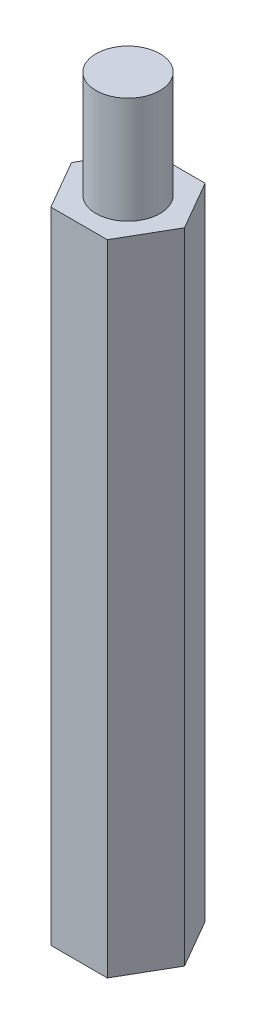
ISO-10303-21;
HEADER;
FILE_DESCRIPTION(('STEP AP214'),'2;1');
FILE_NAME('part.step','',(''),(''),'','','');
FILE_SCHEMA(('AUTOMOTIVE_DESIGN { 1 0 10303 214 1 1 1 1 }'));
ENDSEC;
DATA;
#1=APPLICATION_CONTEXT('core data for automotive mechanical design processes');
#2=APPLICATION_PROTOCOL_DEFINITION('international standard','automotive_design',2000,#1);
#3=PRODUCT_CONTEXT('',#1,'mechanical');
#4=PRODUCT('Part','Part','',(#3));
#5=PRODUCT_RELATED_PRODUCT_CATEGORY('part','',(#4));
#6=PRODUCT_DEFINITION_FORMATION('','',#4);
#7=PRODUCT_DEFINITION_CONTEXT('part definition',#1,'design');
#8=PRODUCT_DEFINITION('design','',#6,#7);
#9=PRODUCT_DEFINITION_SHAPE('','',#8);
#10=(LENGTH_UNIT() NAMED_UNIT(*) SI_UNIT(.MILLI.,.METRE.));
#11=(NAMED_UNIT(*) PLANE_ANGLE_UNIT() SI_UNIT($,.RADIAN.));
#12=(NAMED_UNIT(*) SI_UNIT($,.STERADIAN.) SOLID_ANGLE_UNIT());
#13=UNCERTAINTY_MEASURE_WITH_UNIT(LENGTH_MEASURE(1.E-05),#10,'distance_accuracy_value','');
#14=(GEOMETRIC_REPRESENTATION_CONTEXT(3) GLOBAL_UNCERTAINTY_ASSIGNED_CONTEXT((#13)) GLOBAL_UNIT_ASSIGNED_CONTEXT((#10,
#11,#12)) REPRESENTATION_CONTEXT('',''));
#15=CARTESIAN_POINT('',(0.,0.,0.));
#16=DIRECTION('',(0.,0.,1.));
#17=DIRECTION('',(1.,0.,0.));
#18=AXIS2_PLACEMENT_3D('',#15,#16,#17);
#19=CARTESIAN_POINT('',(1.32500000000003,30.,2.29496732002875));
#20=DIRECTION('',(-0.866025403784441,0.,-0.499999999999995));
#21=DIRECTION('',(-0.499999999999995,0.,0.866025403784441));
#22=AXIS2_PLACEMENT_3D('',#19,#20,#21);
#23=PLANE('',#22);
#24=DIRECTION('',(0.499999999999995,0.,-0.866025403784441));
#25=VECTOR('',#24,1.);
#26=CARTESIAN_POINT('',(1.32500000000003,0.,2.29496732002875));
#27=LINE('',#26,#25);
#28=CARTESIAN_POINT('',(1.32500000000003,0.,2.29496732002875));
#29=VERTEX_POINT('',#28);
#30=CARTESIAN_POINT('',(2.65,0.,0.));
#31=VERTEX_POINT('',#30);
#32=EDGE_CURVE('E130',#29,#31,#27,.T.);
#33=ORIENTED_EDGE('',*,*,#32,.T.);
#34=DIRECTION('',(0.,-1.,0.));
#35=VECTOR('',#34,1.);
#36=CARTESIAN_POINT('',(2.65,30.,0.));
#37=LINE('',#36,#35);
#38=CARTESIAN_POINT('',(2.65,30.,0.));
#39=VERTEX_POINT('',#38);
#40=EDGE_CURVE('E42',#39,#31,#37,.T.);
#41=ORIENTED_EDGE('',*,*,#40,.F.);
#42=DIRECTION('',(0.499999999999995,0.,-0.866025403784441));
#43=VECTOR('',#42,1.);
#44=CARTESIAN_POINT('',(1.32500000000003,30.,2.29496732002875));
#45=LINE('',#44,#43);
#46=CARTESIAN_POINT('',(1.32500000000003,30.,2.29496732002875));
#47=VERTEX_POINT('',#46);
#48=EDGE_CURVE('E147',#47,#39,#45,.T.);
#49=ORIENTED_EDGE('',*,*,#48,.F.);
#50=DIRECTION('',(0.,-1.,0.));
#51=VECTOR('',#50,1.);
#52=CARTESIAN_POINT('',(1.32500000000003,30.,2.29496732002875));
#53=LINE('',#52,#51);
#54=EDGE_CURVE('E126',#47,#29,#53,.T.);
#55=ORIENTED_EDGE('',*,*,#54,.T.);
#56=EDGE_LOOP('',(#33,#41,#49,#55));
#57=FACE_BOUND('',#56,.T.);
#58=ADVANCED_FACE('F39',(#57),#23,.F.);
#59=CARTESIAN_POINT('',(2.65,30.,0.));
#60=DIRECTION('',(-0.866025403784438,0.,0.500000000000001));
#61=DIRECTION('',(0.500000000000001,0.,0.866025403784438));
#62=AXIS2_PLACEMENT_3D('',#59,#60,#61);
#63=PLANE('',#62);
#64=DIRECTION('',(-0.500000000000001,0.,-0.866025403784438));
#65=VECTOR('',#64,1.);
#66=CARTESIAN_POINT('',(2.65,0.,0.));
#67=LINE('',#66,#65);
#68=CARTESIAN_POINT('',(1.32499999999999,0.,-2.29496732002877));
#69=VERTEX_POINT('',#68);
#70=EDGE_CURVE('E134',#31,#69,#67,.T.);
#71=ORIENTED_EDGE('',*,*,#70,.T.);
#72=DIRECTION('',(0.,-1.,0.));
#73=VECTOR('',#72,1.);
#74=CARTESIAN_POINT('',(1.32499999999999,30.,-2.29496732002877));
#75=LINE('',#74,#73);
#76=CARTESIAN_POINT('',(1.32499999999999,30.,-2.29496732002877));
#77=VERTEX_POINT('',#76);
#78=EDGE_CURVE('E153',#77,#69,#75,.T.);
#79=ORIENTED_EDGE('',*,*,#78,.F.);
#80=DIRECTION('',(-0.500000000000001,0.,-0.866025403784438));
#81=VECTOR('',#80,1.);
#82=CARTESIAN_POINT('',(2.65,30.,0.));
#83=LINE('',#82,#81);
#84=EDGE_CURVE('E95',#39,#77,#83,.T.);
#85=ORIENTED_EDGE('',*,*,#84,.F.);
#86=ORIENTED_EDGE('',*,*,#40,.T.);
#87=EDGE_LOOP('',(#71,#79,#85,#86));
#88=FACE_BOUND('',#87,.T.);
#89=ADVANCED_FACE('F160',(#88),#63,.F.);
#90=CARTESIAN_POINT('',(1.32499999999999,30.,-2.29496732002877));
#91=DIRECTION('',(0.,0.,1.));
#92=DIRECTION('',(1.,0.,0.));
#93=AXIS2_PLACEMENT_3D('',#90,#91,#92);
#94=PLANE('',#93);
#95=DIRECTION('',(-1.,0.,0.));
#96=VECTOR('',#95,1.);
#97=CARTESIAN_POINT('',(1.32499999999999,0.,-2.29496732002877));
#98=LINE('',#97,#96);
#99=CARTESIAN_POINT('',(-1.32500000000001,0.,-2.29496732002876));
#100=VERTEX_POINT('',#99);
#101=EDGE_CURVE('E138',#69,#100,#98,.T.);
#102=ORIENTED_EDGE('',*,*,#101,.T.);
#103=DIRECTION('',(0.,-1.,0.));
#104=VECTOR('',#103,1.);
#105=CARTESIAN_POINT('',(-1.32500000000001,30.,-2.29496732002876));
#106=LINE('',#105,#104);
#107=CARTESIAN_POINT('',(-1.32500000000001,30.,-2.29496732002876));
#108=VERTEX_POINT('',#107);
#109=EDGE_CURVE('E119',#108,#100,#106,.T.);
#110=ORIENTED_EDGE('',*,*,#109,.F.);
#111=DIRECTION('',(-1.,0.,0.));
#112=VECTOR('',#111,1.);
#113=CARTESIAN_POINT('',(1.32499999999999,30.,-2.29496732002877));
#114=LINE('',#113,#112);
#115=EDGE_CURVE('E108',#77,#108,#114,.T.);
#116=ORIENTED_EDGE('',*,*,#115,.F.);
#117=ORIENTED_EDGE('',*,*,#78,.T.);
#118=EDGE_LOOP('',(#102,#110,#116,#117));
#119=FACE_BOUND('',#118,.T.);
#120=ADVANCED_FACE('F166',(#119),#94,.F.);
#121=CARTESIAN_POINT('',(-1.32500000000001,30.,-2.29496732002876));
#122=DIRECTION('',(0.866025403784442,0.,0.499999999999995));
#123=DIRECTION('',(0.499999999999995,0.,-0.866025403784442));
#124=AXIS2_PLACEMENT_3D('',#121,#122,#123);
#125=PLANE('',#124);
#126=DIRECTION('',(-0.499999999999995,0.,0.866025403784442));
#127=VECTOR('',#126,1.);
#128=CARTESIAN_POINT('',(-1.32500000000001,0.,-2.29496732002876));
#129=LINE('',#128,#127);
#130=CARTESIAN_POINT('',(-2.65,0.,0.));
#131=VERTEX_POINT('',#130);
#132=EDGE_CURVE('E117',#100,#131,#129,.T.);
#133=ORIENTED_EDGE('',*,*,#132,.T.);
#134=DIRECTION('',(0.,-1.,0.));
#135=VECTOR('',#134,1.);
#136=CARTESIAN_POINT('',(-2.65,30.,0.));
#137=LINE('',#136,#135);
#138=CARTESIAN_POINT('',(-2.65,30.,0.));
#139=VERTEX_POINT('',#138);
#140=EDGE_CURVE('E114',#139,#131,#137,.T.);
#141=ORIENTED_EDGE('',*,*,#140,.F.);
#142=DIRECTION('',(-0.499999999999995,0.,0.866025403784442));
#143=VECTOR('',#142,1.);
#144=CARTESIAN_POINT('',(-1.32500000000001,30.,-2.29496732002876));
#145=LINE('',#144,#143);
#146=EDGE_CURVE('E102',#108,#139,#145,.T.);
#147=ORIENTED_EDGE('',*,*,#146,.F.);
#148=ORIENTED_EDGE('',*,*,#109,.T.);
#149=EDGE_LOOP('',(#133,#141,#147,#148));
#150=FACE_BOUND('',#149,.T.);
#151=ADVANCED_FACE('F115',(#150),#125,.F.);
#152=CARTESIAN_POINT('',(-2.65,30.,0.));
#153=DIRECTION('',(0.866025403784435,0.,-0.500000000000007));
#154=DIRECTION('',(-0.500000000000007,0.,-0.866025403784435));
#155=AXIS2_PLACEMENT_3D('',#152,#153,#154);
#156=PLANE('',#155);
#157=DIRECTION('',(0.500000000000007,0.,0.866025403784435));
#158=VECTOR('',#157,1.);
#159=CARTESIAN_POINT('',(-2.65,0.,0.));
#160=LINE('',#159,#158);
#161=CARTESIAN_POINT('',(-1.32499999999998,0.,2.29496732002877));
#162=VERTEX_POINT('',#161);
#163=EDGE_CURVE('E80',#131,#162,#160,.T.);
#164=ORIENTED_EDGE('',*,*,#163,.T.);
#165=DIRECTION('',(0.,-1.,0.));
#166=VECTOR('',#165,1.);
#167=CARTESIAN_POINT('',(-1.32499999999998,30.,2.29496732002877));
#168=LINE('',#167,#166);
#169=CARTESIAN_POINT('',(-1.32499999999998,30.,2.29496732002877));
#170=VERTEX_POINT('',#169);
#171=EDGE_CURVE('E120',#170,#162,#168,.T.);
#172=ORIENTED_EDGE('',*,*,#171,.F.);
#173=DIRECTION('',(0.500000000000007,0.,0.866025403784435));
#174=VECTOR('',#173,1.);
#175=CARTESIAN_POINT('',(-2.65,30.,0.));
#176=LINE('',#175,#174);
#177=EDGE_CURVE('E106',#139,#170,#176,.T.);
#178=ORIENTED_EDGE('',*,*,#177,.F.);
#179=ORIENTED_EDGE('',*,*,#140,.T.);
#180=EDGE_LOOP('',(#164,#172,#178,#179));
#181=FACE_BOUND('',#180,.T.);
#182=ADVANCED_FACE('F122',(#181),#156,.F.);
#183=CARTESIAN_POINT('',(-1.32499999999998,30.,2.29496732002877));
#184=DIRECTION('',(0.,0.,-1.));
#185=DIRECTION('',(-1.,0.,0.));
#186=AXIS2_PLACEMENT_3D('',#183,#184,#185);
#187=PLANE('',#186);
#188=DIRECTION('',(1.,0.,0.));
#189=VECTOR('',#188,1.);
#190=CARTESIAN_POINT('',(-1.32499999999998,0.,2.29496732002877));
#191=LINE('',#190,#189);
#192=EDGE_CURVE('E86',#162,#29,#191,.T.);
#193=ORIENTED_EDGE('',*,*,#192,.T.);
#194=ORIENTED_EDGE('',*,*,#54,.F.);
#195=DIRECTION('',(1.,0.,0.));
#196=VECTOR('',#195,1.);
#197=CARTESIAN_POINT('',(-1.32499999999998,30.,2.29496732002877));
#198=LINE('',#197,#196);
#199=EDGE_CURVE('E57',#170,#47,#198,.T.);
#200=ORIENTED_EDGE('',*,*,#199,.F.);
#201=ORIENTED_EDGE('',*,*,#171,.T.);
#202=EDGE_LOOP('',(#193,#194,#200,#201));
#203=FACE_BOUND('',#202,.T.);
#204=ADVANCED_FACE('F195',(#203),#187,.F.);
#205=CARTESIAN_POINT('',(0.,30.,0.));
#206=DIRECTION('',(0.,1.,0.));
#207=DIRECTION('',(0.,0.,1.));
#208=AXIS2_PLACEMENT_3D('',#205,#206,#207);
#209=PLANE('',#208);
#210=CARTESIAN_POINT('',(0.,30.,0.));
#211=DIRECTION('',(0.,1.,0.));
#212=DIRECTION('',(0.,0.,1.));
#213=AXIS2_PLACEMENT_3D('',#210,#211,#212);
#214=CIRCLE('',#213,1.5);
#215=CARTESIAN_POINT('',(0.,30.,1.5));
#216=VERTEX_POINT('',#215);
#217=EDGE_CURVE('E11',#216,#216,#214,.T.);
#218=ORIENTED_EDGE('',*,*,#217,.F.);
#219=EDGE_LOOP('',(#218));
#220=FACE_BOUND('',#219,.T.);
#221=ORIENTED_EDGE('',*,*,#48,.T.);
#222=ORIENTED_EDGE('',*,*,#84,.T.);
#223=ORIENTED_EDGE('',*,*,#115,.T.);
#224=ORIENTED_EDGE('',*,*,#146,.T.);
#225=ORIENTED_EDGE('',*,*,#177,.T.);
#226=ORIENTED_EDGE('',*,*,#199,.T.);
#227=EDGE_LOOP('',(#221,#222,#223,#224,#225,#226));
#228=FACE_BOUND('',#227,.T.);
#229=ADVANCED_FACE('F104',(#220,#228),#209,.T.);
#230=CARTESIAN_POINT('',(0.,0.,0.));
#231=DIRECTION('',(0.,1.,0.));
#232=DIRECTION('',(0.,0.,1.));
#233=AXIS2_PLACEMENT_3D('',#230,#231,#232);
#234=PLANE('',#233);
#235=CARTESIAN_POINT('',(0.,0.,0.));
#236=DIRECTION('',(0.,-1.,0.));
#237=DIRECTION('',(0.,0.,-1.));
#238=AXIS2_PLACEMENT_3D('',#235,#236,#237);
#239=CIRCLE('',#238,1.6);
#240=CARTESIAN_POINT('',(0.,0.,-1.6));
#241=VERTEX_POINT('',#240);
#242=EDGE_CURVE('E173',#241,#241,#239,.T.);
#243=ORIENTED_EDGE('',*,*,#242,.F.);
#244=EDGE_LOOP('',(#243));
#245=FACE_BOUND('',#244,.T.);
#246=ORIENTED_EDGE('',*,*,#32,.F.);
#247=ORIENTED_EDGE('',*,*,#192,.F.);
#248=ORIENTED_EDGE('',*,*,#163,.F.);
#249=ORIENTED_EDGE('',*,*,#132,.F.);
#250=ORIENTED_EDGE('',*,*,#101,.F.);
#251=ORIENTED_EDGE('',*,*,#70,.F.);
#252=EDGE_LOOP('',(#246,#247,#248,#249,#250,#251));
#253=FACE_BOUND('',#252,.T.);
#254=ADVANCED_FACE('F165',(#245,#253),#234,.F.);
#255=CARTESIAN_POINT('',(0.,5.,0.));
#256=DIRECTION('',(0.,-1.,0.));
#257=DIRECTION('',(0.,0.,-1.));
#258=AXIS2_PLACEMENT_3D('',#255,#256,#257);
#259=CYLINDRICAL_SURFACE('',#258,1.6);
#260=CARTESIAN_POINT('',(0.,5.,0.));
#261=DIRECTION('',(0.,-1.,0.));
#262=DIRECTION('',(0.,0.,-1.));
#263=AXIS2_PLACEMENT_3D('',#260,#261,#262);
#264=CIRCLE('',#263,1.6);
#265=CARTESIAN_POINT('',(0.,5.,-1.6));
#266=VERTEX_POINT('',#265);
#267=EDGE_CURVE('E135',#266,#266,#264,.T.);
#268=ORIENTED_EDGE('',*,*,#267,.F.);
#269=EDGE_LOOP('',(#268));
#270=FACE_BOUND('',#269,.T.);
#271=ORIENTED_EDGE('',*,*,#242,.T.);
#272=EDGE_LOOP('',(#271));
#273=FACE_BOUND('',#272,.T.);
#274=ADVANCED_FACE('F201',(#270,#273),#259,.F.);
#275=CARTESIAN_POINT('',(0.,5.,0.));
#276=DIRECTION('',(0.,-1.,0.));
#277=DIRECTION('',(0.,0.,-1.));
#278=AXIS2_PLACEMENT_3D('',#275,#276,#277);
#279=PLANE('',#278);
#280=ORIENTED_EDGE('',*,*,#267,.T.);
#281=EDGE_LOOP('',(#280));
#282=FACE_BOUND('',#281,.T.);
#283=ADVANCED_FACE('F190',(#282),#279,.T.);
#284=CARTESIAN_POINT('',(0.,35.,0.));
#285=DIRECTION('',(0.,-1.,0.));
#286=DIRECTION('',(0.,0.,-1.));
#287=AXIS2_PLACEMENT_3D('',#284,#285,#286);
#288=CYLINDRICAL_SURFACE('',#287,1.5);
#289=CARTESIAN_POINT('',(0.,35.,0.));
#290=DIRECTION('',(0.,1.,0.));
#291=DIRECTION('',(0.,0.,1.));
#292=AXIS2_PLACEMENT_3D('',#289,#290,#291);
#293=CIRCLE('',#292,1.5);
#294=CARTESIAN_POINT('',(0.,35.,1.5));
#295=VERTEX_POINT('',#294);
#296=EDGE_CURVE('E177',#295,#295,#293,.T.);
#297=ORIENTED_EDGE('',*,*,#296,.F.);
#298=EDGE_LOOP('',(#297));
#299=FACE_BOUND('',#298,.T.);
#300=ORIENTED_EDGE('',*,*,#217,.T.);
#301=EDGE_LOOP('',(#300));
#302=FACE_BOUND('',#301,.T.);
#303=ADVANCED_FACE('F187',(#299,#302),#288,.T.);
#304=CARTESIAN_POINT('',(0.,35.,0.));
#305=DIRECTION('',(0.,1.,0.));
#306=DIRECTION('',(0.,0.,1.));
#307=AXIS2_PLACEMENT_3D('',#304,#305,#306);
#308=PLANE('',#307);
#309=ORIENTED_EDGE('',*,*,#296,.T.);
#310=EDGE_LOOP('',(#309));
#311=FACE_BOUND('',#310,.T.);
#312=ADVANCED_FACE('F185',(#311),#308,.T.);
#313=CLOSED_SHELL('',(#58,#89,#120,#151,#182,#204,#229,#254,#274,#283,#303,#312));
#314=MANIFOLD_SOLID_BREP('B2',#313);
#315=ADVANCED_BREP_SHAPE_REPRESENTATION('',(#18,#314),#14);
#316=SHAPE_DEFINITION_REPRESENTATION(#9,#315);
ENDSEC;
END-ISO-10303-21;
